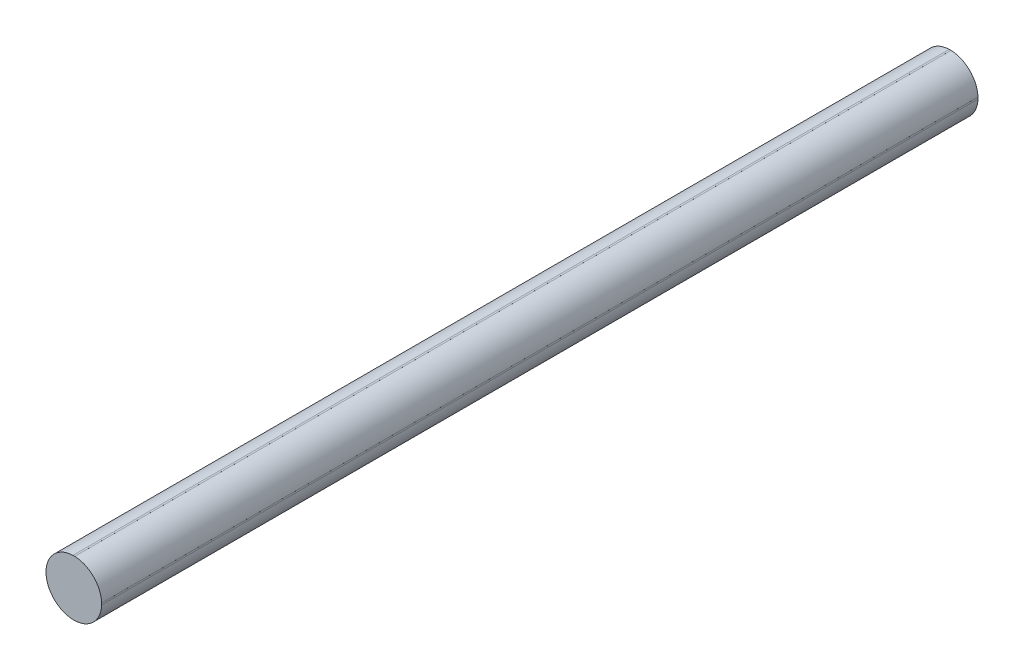
ISO-10303-21;
HEADER;
FILE_DESCRIPTION(('STEP AP214'),'2;1');
FILE_NAME('part.step','',(''),(''),'','','');
FILE_SCHEMA(('AUTOMOTIVE_DESIGN { 1 0 10303 214 1 1 1 1 }'));
ENDSEC;
DATA;
#1=APPLICATION_CONTEXT('core data for automotive mechanical design processes');
#2=APPLICATION_PROTOCOL_DEFINITION('international standard','automotive_design',2000,#1);
#3=PRODUCT_CONTEXT('',#1,'mechanical');
#4=PRODUCT('Part','Part','',(#3));
#5=PRODUCT_RELATED_PRODUCT_CATEGORY('part','',(#4));
#6=PRODUCT_DEFINITION_FORMATION('','',#4);
#7=PRODUCT_DEFINITION_CONTEXT('part definition',#1,'design');
#8=PRODUCT_DEFINITION('design','',#6,#7);
#9=PRODUCT_DEFINITION_SHAPE('','',#8);
#10=(LENGTH_UNIT() NAMED_UNIT(*) SI_UNIT(.MILLI.,.METRE.));
#11=(NAMED_UNIT(*) PLANE_ANGLE_UNIT() SI_UNIT($,.RADIAN.));
#12=(NAMED_UNIT(*) SI_UNIT($,.STERADIAN.) SOLID_ANGLE_UNIT());
#13=UNCERTAINTY_MEASURE_WITH_UNIT(LENGTH_MEASURE(1.E-05),#10,'distance_accuracy_value','');
#14=(GEOMETRIC_REPRESENTATION_CONTEXT(3) GLOBAL_UNCERTAINTY_ASSIGNED_CONTEXT((#13)) GLOBAL_UNIT_ASSIGNED_CONTEXT((#10,
#11,#12)) REPRESENTATION_CONTEXT('',''));
#15=CARTESIAN_POINT('',(0.,0.,0.));
#16=DIRECTION('',(0.,0.,1.));
#17=DIRECTION('',(1.,0.,0.));
#18=AXIS2_PLACEMENT_3D('',#15,#16,#17);
#19=CARTESIAN_POINT('',(0.,0.,1000.));
#20=DIRECTION('',(0.,0.,-1.));
#21=DIRECTION('',(-1.,0.,0.));
#22=AXIS2_PLACEMENT_3D('',#19,#20,#21);
#23=CYLINDRICAL_SURFACE('',#22,31.75);
#24=CARTESIAN_POINT('',(0.,0.,0.));
#25=DIRECTION('',(0.,0.,1.));
#26=DIRECTION('',(1.,0.,0.));
#27=AXIS2_PLACEMENT_3D('',#24,#25,#26);
#28=CIRCLE('',#27,31.75);
#29=CARTESIAN_POINT('',(-31.734248061046,-1.00000000000004,0.));
#30=VERTEX_POINT('',#29);
#31=CARTESIAN_POINT('',(-1.,-31.734248061046,0.));
#32=VERTEX_POINT('',#31);
#33=EDGE_CURVE('E265',#30,#32,#28,.T.);
#34=ORIENTED_EDGE('',*,*,#33,.T.);
#35=DIRECTION('',(0.,0.,-1.));
#36=VECTOR('',#35,1.);
#37=CARTESIAN_POINT('',(-1.,-31.734248061046,1000.));
#38=LINE('',#37,#36);
#39=CARTESIAN_POINT('',(-1.,-31.734248061046,1000.));
#40=VERTEX_POINT('',#39);
#41=EDGE_CURVE('E61',#32,#40,#38,.F.);
#42=ORIENTED_EDGE('',*,*,#41,.T.);
#43=CARTESIAN_POINT('',(0.,0.,1000.));
#44=DIRECTION('',(0.,0.,1.));
#45=DIRECTION('',(1.,0.,0.));
#46=AXIS2_PLACEMENT_3D('',#43,#44,#45);
#47=CIRCLE('',#46,31.75);
#48=CARTESIAN_POINT('',(-31.734248061046,-1.00000000000004,1000.));
#49=VERTEX_POINT('',#48);
#50=EDGE_CURVE('E159',#49,#40,#47,.T.);
#51=ORIENTED_EDGE('',*,*,#50,.F.);
#52=DIRECTION('',(0.,0.,-1.));
#53=VECTOR('',#52,1.);
#54=CARTESIAN_POINT('',(-31.734248061046,-1.00000000000004,1000.));
#55=LINE('',#54,#53);
#56=EDGE_CURVE('E206',#49,#30,#55,.T.);
#57=ORIENTED_EDGE('',*,*,#56,.T.);
#58=EDGE_LOOP('',(#34,#42,#51,#57));
#59=FACE_BOUND('',#58,.T.);
#60=ADVANCED_FACE('F37',(#59),#23,.T.);
#61=CARTESIAN_POINT('',(-1.00000000000001,31.734248061046,0.));
#62=VERTEX_POINT('',#61);
#63=CARTESIAN_POINT('',(-31.734248061046,0.99999999999997,0.));
#64=VERTEX_POINT('',#63);
#65=EDGE_CURVE('E266',#62,#64,#28,.T.);
#66=ORIENTED_EDGE('',*,*,#65,.T.);
#67=DIRECTION('',(0.,0.,-1.));
#68=VECTOR('',#67,1.);
#69=CARTESIAN_POINT('',(-31.734248061046,0.99999999999997,1000.));
#70=LINE('',#69,#68);
#71=CARTESIAN_POINT('',(-31.734248061046,0.99999999999997,1000.));
#72=VERTEX_POINT('',#71);
#73=EDGE_CURVE('E209',#64,#72,#70,.F.);
#74=ORIENTED_EDGE('',*,*,#73,.T.);
#75=CARTESIAN_POINT('',(-1.00000000000001,31.734248061046,1000.));
#76=VERTEX_POINT('',#75);
#77=EDGE_CURVE('E46',#76,#72,#47,.T.);
#78=ORIENTED_EDGE('',*,*,#77,.F.);
#79=DIRECTION('',(0.,0.,-1.));
#80=VECTOR('',#79,1.);
#81=CARTESIAN_POINT('',(-1.00000000000001,31.734248061046,1000.));
#82=LINE('',#81,#80);
#83=EDGE_CURVE('E233',#76,#62,#82,.T.);
#84=ORIENTED_EDGE('',*,*,#83,.T.);
#85=EDGE_LOOP('',(#66,#74,#78,#84));
#86=FACE_BOUND('',#85,.T.);
#87=ADVANCED_FACE('F272',(#86),#23,.T.);
#88=CARTESIAN_POINT('',(31.734248061046,1.,0.));
#89=VERTEX_POINT('',#88);
#90=CARTESIAN_POINT('',(0.999999999999993,31.734248061046,0.));
#91=VERTEX_POINT('',#90);
#92=EDGE_CURVE('E41',#89,#91,#28,.T.);
#93=ORIENTED_EDGE('',*,*,#92,.T.);
#94=DIRECTION('',(0.,0.,-1.));
#95=VECTOR('',#94,1.);
#96=CARTESIAN_POINT('',(0.999999999999993,31.734248061046,1000.));
#97=LINE('',#96,#95);
#98=CARTESIAN_POINT('',(0.999999999999993,31.734248061046,1000.));
#99=VERTEX_POINT('',#98);
#100=EDGE_CURVE('E236',#91,#99,#97,.F.);
#101=ORIENTED_EDGE('',*,*,#100,.T.);
#102=CARTESIAN_POINT('',(31.734248061046,1.,1000.));
#103=VERTEX_POINT('',#102);
#104=EDGE_CURVE('E11',#103,#99,#47,.T.);
#105=ORIENTED_EDGE('',*,*,#104,.F.);
#106=DIRECTION('',(0.,0.,-1.));
#107=VECTOR('',#106,1.);
#108=CARTESIAN_POINT('',(31.734248061046,1.,1000.));
#109=LINE('',#108,#107);
#110=EDGE_CURVE('E259',#103,#89,#109,.T.);
#111=ORIENTED_EDGE('',*,*,#110,.T.);
#112=EDGE_LOOP('',(#93,#101,#105,#111));
#113=FACE_BOUND('',#112,.T.);
#114=ADVANCED_FACE('F303',(#113),#23,.T.);
#115=CARTESIAN_POINT('',(1.,-31.734248061046,1000.));
#116=VERTEX_POINT('',#115);
#117=CARTESIAN_POINT('',(31.734248061046,-0.999999999999996,1000.));
#118=VERTEX_POINT('',#117);
#119=EDGE_CURVE('E47',#116,#118,#47,.T.);
#120=ORIENTED_EDGE('',*,*,#119,.F.);
#121=DIRECTION('',(0.,0.,-1.));
#122=VECTOR('',#121,1.);
#123=CARTESIAN_POINT('',(1.,-31.734248061046,1000.));
#124=LINE('',#123,#122);
#125=CARTESIAN_POINT('',(1.,-31.734248061046,0.));
#126=VERTEX_POINT('',#125);
#127=EDGE_CURVE('E183',#116,#126,#124,.T.);
#128=ORIENTED_EDGE('',*,*,#127,.T.);
#129=CARTESIAN_POINT('',(31.734248061046,-0.999999999999996,0.));
#130=VERTEX_POINT('',#129);
#131=EDGE_CURVE('E262',#126,#130,#28,.T.);
#132=ORIENTED_EDGE('',*,*,#131,.T.);
#133=DIRECTION('',(0.,0.,-1.));
#134=VECTOR('',#133,1.);
#135=CARTESIAN_POINT('',(31.734248061046,-0.999999999999996,1000.));
#136=LINE('',#135,#134);
#137=EDGE_CURVE('E261',#130,#118,#136,.F.);
#138=ORIENTED_EDGE('',*,*,#137,.T.);
#139=EDGE_LOOP('',(#120,#128,#132,#138));
#140=FACE_BOUND('',#139,.T.);
#141=ADVANCED_FACE('F39',(#140),#23,.T.);
#142=CARTESIAN_POINT('',(0.,0.,1000.));
#143=DIRECTION('',(0.,0.,1.));
#144=DIRECTION('',(1.,0.,0.));
#145=AXIS2_PLACEMENT_3D('',#142,#143,#144);
#146=PLANE('',#145);
#147=ORIENTED_EDGE('',*,*,#50,.T.);
#148=DIRECTION('',(0.,-1.,0.));
#149=VECTOR('',#148,1.);
#150=CARTESIAN_POINT('',(-1.,-30.75,1000.));
#151=LINE('',#150,#149);
#152=CARTESIAN_POINT('',(-1.,-31.75,1000.));
#153=VERTEX_POINT('',#152);
#154=EDGE_CURVE('E151',#40,#153,#151,.T.);
#155=ORIENTED_EDGE('',*,*,#154,.T.);
#156=DIRECTION('',(1.,0.,0.));
#157=VECTOR('',#156,1.);
#158=CARTESIAN_POINT('',(0.,-31.75,1000.));
#159=LINE('',#158,#157);
#160=CARTESIAN_POINT('',(1.,-31.75,1000.));
#161=VERTEX_POINT('',#160);
#162=EDGE_CURVE('E156',#153,#161,#159,.T.);
#163=ORIENTED_EDGE('',*,*,#162,.T.);
#164=DIRECTION('',(0.,1.,0.));
#165=VECTOR('',#164,1.);
#166=CARTESIAN_POINT('',(1.,-31.75,1000.));
#167=LINE('',#166,#165);
#168=EDGE_CURVE('E170',#161,#116,#167,.T.);
#169=ORIENTED_EDGE('',*,*,#168,.T.);
#170=ORIENTED_EDGE('',*,*,#119,.T.);
#171=DIRECTION('',(1.,0.,0.));
#172=VECTOR('',#171,1.);
#173=CARTESIAN_POINT('',(31.75,-0.999999999999996,1000.));
#174=LINE('',#173,#172);
#175=CARTESIAN_POINT('',(31.75,-0.999999999999996,1000.));
#176=VERTEX_POINT('',#175);
#177=EDGE_CURVE('E248',#118,#176,#174,.T.);
#178=ORIENTED_EDGE('',*,*,#177,.T.);
#179=DIRECTION('',(0.,1.,0.));
#180=VECTOR('',#179,1.);
#181=CARTESIAN_POINT('',(31.75,0.,1000.));
#182=LINE('',#181,#180);
#183=CARTESIAN_POINT('',(31.75,1.,1000.));
#184=VERTEX_POINT('',#183);
#185=EDGE_CURVE('E251',#176,#184,#182,.T.);
#186=ORIENTED_EDGE('',*,*,#185,.T.);
#187=DIRECTION('',(-1.,0.,0.));
#188=VECTOR('',#187,1.);
#189=CARTESIAN_POINT('',(30.75,1.,1000.));
#190=LINE('',#189,#188);
#191=EDGE_CURVE('E238',#184,#103,#190,.T.);
#192=ORIENTED_EDGE('',*,*,#191,.T.);
#193=ORIENTED_EDGE('',*,*,#104,.T.);
#194=DIRECTION('',(0.,1.,0.));
#195=VECTOR('',#194,1.);
#196=CARTESIAN_POINT('',(0.999999999999993,31.75,1000.));
#197=LINE('',#196,#195);
#198=CARTESIAN_POINT('',(0.999999999999993,31.75,1000.));
#199=VERTEX_POINT('',#198);
#200=EDGE_CURVE('E221',#99,#199,#197,.T.);
#201=ORIENTED_EDGE('',*,*,#200,.T.);
#202=DIRECTION('',(-1.,0.,0.));
#203=VECTOR('',#202,1.);
#204=CARTESIAN_POINT('',(0.,31.75,1000.));
#205=LINE('',#204,#203);
#206=CARTESIAN_POINT('',(-1.00000000000001,31.75,1000.));
#207=VERTEX_POINT('',#206);
#208=EDGE_CURVE('E224',#199,#207,#205,.T.);
#209=ORIENTED_EDGE('',*,*,#208,.T.);
#210=DIRECTION('',(0.,-1.,0.));
#211=VECTOR('',#210,1.);
#212=CARTESIAN_POINT('',(-1.00000000000001,30.75,1000.));
#213=LINE('',#212,#211);
#214=EDGE_CURVE('E211',#207,#76,#213,.T.);
#215=ORIENTED_EDGE('',*,*,#214,.T.);
#216=ORIENTED_EDGE('',*,*,#77,.T.);
#217=DIRECTION('',(-1.,0.,0.));
#218=VECTOR('',#217,1.);
#219=CARTESIAN_POINT('',(-30.75,0.999999999999973,1000.));
#220=LINE('',#219,#218);
#221=CARTESIAN_POINT('',(-31.75,0.99999999999997,1000.));
#222=VERTEX_POINT('',#221);
#223=EDGE_CURVE('E186',#72,#222,#220,.T.);
#224=ORIENTED_EDGE('',*,*,#223,.T.);
#225=DIRECTION('',(0.,-1.,0.));
#226=VECTOR('',#225,1.);
#227=CARTESIAN_POINT('',(-31.75,0.,1000.));
#228=LINE('',#227,#226);
#229=CARTESIAN_POINT('',(-31.75,-1.00000000000004,1000.));
#230=VERTEX_POINT('',#229);
#231=EDGE_CURVE('E196',#222,#230,#228,.T.);
#232=ORIENTED_EDGE('',*,*,#231,.T.);
#233=DIRECTION('',(1.,0.,0.));
#234=VECTOR('',#233,1.);
#235=CARTESIAN_POINT('',(-31.75,-1.00000000000004,1000.));
#236=LINE('',#235,#234);
#237=EDGE_CURVE('E198',#230,#49,#236,.T.);
#238=ORIENTED_EDGE('',*,*,#237,.T.);
#239=EDGE_LOOP('',(#147,#155,#163,#169,#170,#178,#186,#192,#193,#201,#209,#215,#216,#224,#232,#238));
#240=FACE_BOUND('',#239,.T.);
#241=ADVANCED_FACE('F153',(#240),#146,.T.);
#242=CARTESIAN_POINT('',(0.,0.,0.));
#243=DIRECTION('',(0.,0.,1.));
#244=DIRECTION('',(1.,0.,0.));
#245=AXIS2_PLACEMENT_3D('',#242,#243,#244);
#246=PLANE('',#245);
#247=DIRECTION('',(0.,-1.,0.));
#248=VECTOR('',#247,1.);
#249=CARTESIAN_POINT('',(1.,-31.75,0.));
#250=LINE('',#249,#248);
#251=CARTESIAN_POINT('',(1.,-31.75,0.));
#252=VERTEX_POINT('',#251);
#253=EDGE_CURVE('E179',#126,#252,#250,.T.);
#254=ORIENTED_EDGE('',*,*,#253,.T.);
#255=DIRECTION('',(-1.,0.,0.));
#256=VECTOR('',#255,1.);
#257=CARTESIAN_POINT('',(0.,-31.75,0.));
#258=LINE('',#257,#256);
#259=CARTESIAN_POINT('',(-1.,-31.75,0.));
#260=VERTEX_POINT('',#259);
#261=EDGE_CURVE('E181',#252,#260,#258,.T.);
#262=ORIENTED_EDGE('',*,*,#261,.T.);
#263=DIRECTION('',(0.,1.,0.));
#264=VECTOR('',#263,1.);
#265=CARTESIAN_POINT('',(-1.,-30.75,0.));
#266=LINE('',#265,#264);
#267=EDGE_CURVE('E167',#260,#32,#266,.T.);
#268=ORIENTED_EDGE('',*,*,#267,.T.);
#269=ORIENTED_EDGE('',*,*,#33,.F.);
#270=DIRECTION('',(-1.,0.,0.));
#271=VECTOR('',#270,1.);
#272=CARTESIAN_POINT('',(-31.75,-1.00000000000004,0.));
#273=LINE('',#272,#271);
#274=CARTESIAN_POINT('',(-31.75,-1.00000000000004,0.));
#275=VERTEX_POINT('',#274);
#276=EDGE_CURVE('E187',#30,#275,#273,.T.);
#277=ORIENTED_EDGE('',*,*,#276,.T.);
#278=DIRECTION('',(0.,1.,0.));
#279=VECTOR('',#278,1.);
#280=CARTESIAN_POINT('',(-31.75,0.,0.));
#281=LINE('',#280,#279);
#282=CARTESIAN_POINT('',(-31.75,0.99999999999997,0.));
#283=VERTEX_POINT('',#282);
#284=EDGE_CURVE('E194',#275,#283,#281,.T.);
#285=ORIENTED_EDGE('',*,*,#284,.T.);
#286=DIRECTION('',(1.,0.,0.));
#287=VECTOR('',#286,1.);
#288=CARTESIAN_POINT('',(-30.75,0.999999999999973,0.));
#289=LINE('',#288,#287);
#290=EDGE_CURVE('E190',#283,#64,#289,.T.);
#291=ORIENTED_EDGE('',*,*,#290,.T.);
#292=ORIENTED_EDGE('',*,*,#65,.F.);
#293=DIRECTION('',(0.,1.,0.));
#294=VECTOR('',#293,1.);
#295=CARTESIAN_POINT('',(-1.00000000000001,30.75,0.));
#296=LINE('',#295,#294);
#297=CARTESIAN_POINT('',(-1.00000000000001,31.75,0.));
#298=VERTEX_POINT('',#297);
#299=EDGE_CURVE('E218',#62,#298,#296,.T.);
#300=ORIENTED_EDGE('',*,*,#299,.T.);
#301=DIRECTION('',(1.,0.,0.));
#302=VECTOR('',#301,1.);
#303=CARTESIAN_POINT('',(0.,31.75,0.));
#304=LINE('',#303,#302);
#305=CARTESIAN_POINT('',(0.999999999999993,31.75,0.));
#306=VERTEX_POINT('',#305);
#307=EDGE_CURVE('E215',#298,#306,#304,.T.);
#308=ORIENTED_EDGE('',*,*,#307,.T.);
#309=DIRECTION('',(0.,-1.,0.));
#310=VECTOR('',#309,1.);
#311=CARTESIAN_POINT('',(0.999999999999993,31.75,0.));
#312=LINE('',#311,#310);
#313=EDGE_CURVE('E212',#306,#91,#312,.T.);
#314=ORIENTED_EDGE('',*,*,#313,.T.);
#315=ORIENTED_EDGE('',*,*,#92,.F.);
#316=DIRECTION('',(1.,0.,0.));
#317=VECTOR('',#316,1.);
#318=CARTESIAN_POINT('',(30.75,1.,0.));
#319=LINE('',#318,#317);
#320=CARTESIAN_POINT('',(31.75,1.,0.));
#321=VERTEX_POINT('',#320);
#322=EDGE_CURVE('E245',#89,#321,#319,.T.);
#323=ORIENTED_EDGE('',*,*,#322,.T.);
#324=DIRECTION('',(0.,-1.,0.));
#325=VECTOR('',#324,1.);
#326=CARTESIAN_POINT('',(31.75,0.,0.));
#327=LINE('',#326,#325);
#328=CARTESIAN_POINT('',(31.75,-0.999999999999996,0.));
#329=VERTEX_POINT('',#328);
#330=EDGE_CURVE('E242',#321,#329,#327,.T.);
#331=ORIENTED_EDGE('',*,*,#330,.T.);
#332=DIRECTION('',(-1.,0.,0.));
#333=VECTOR('',#332,1.);
#334=CARTESIAN_POINT('',(31.75,-0.999999999999996,0.));
#335=LINE('',#334,#333);
#336=EDGE_CURVE('E239',#329,#130,#335,.T.);
#337=ORIENTED_EDGE('',*,*,#336,.T.);
#338=ORIENTED_EDGE('',*,*,#131,.F.);
#339=EDGE_LOOP('',(#254,#262,#268,#269,#277,#285,#291,#292,#300,#308,#314,#315,#323,#331,#337,#338));
#340=FACE_BOUND('',#339,.T.);
#341=ADVANCED_FACE('F283',(#340),#246,.F.);
#342=CARTESIAN_POINT('',(31.75,0.,-2.23606797749998));
#343=DIRECTION('',(1.,0.,0.));
#344=DIRECTION('',(0.,0.,-1.));
#345=AXIS2_PLACEMENT_3D('',#342,#343,#344);
#346=PLANE('',#345);
#347=DIRECTION('',(0.,0.,1.));
#348=VECTOR('',#347,1.);
#349=CARTESIAN_POINT('',(31.75,-0.999999999999996,-2.23606797749998));
#350=LINE('',#349,#348);
#351=EDGE_CURVE('E243',#329,#176,#350,.T.);
#352=ORIENTED_EDGE('',*,*,#351,.F.);
#353=ORIENTED_EDGE('',*,*,#330,.F.);
#354=DIRECTION('',(0.,0.,1.));
#355=VECTOR('',#354,1.);
#356=CARTESIAN_POINT('',(31.75,1.,-2.23606797749998));
#357=LINE('',#356,#355);
#358=EDGE_CURVE('E253',#321,#184,#357,.T.);
#359=ORIENTED_EDGE('',*,*,#358,.T.);
#360=ORIENTED_EDGE('',*,*,#185,.F.);
#361=EDGE_LOOP('',(#352,#353,#359,#360));
#362=FACE_BOUND('',#361,.T.);
#363=ADVANCED_FACE('F312',(#362),#346,.T.);
#364=CARTESIAN_POINT('',(31.75,-0.999999999999996,-2.23606797749998));
#365=DIRECTION('',(0.,-1.,0.));
#366=DIRECTION('',(1.,0.,0.));
#367=AXIS2_PLACEMENT_3D('',#364,#365,#366);
#368=PLANE('',#367);
#369=ORIENTED_EDGE('',*,*,#137,.F.);
#370=ORIENTED_EDGE('',*,*,#336,.F.);
#371=ORIENTED_EDGE('',*,*,#351,.T.);
#372=ORIENTED_EDGE('',*,*,#177,.F.);
#373=EDGE_LOOP('',(#369,#370,#371,#372));
#374=FACE_BOUND('',#373,.T.);
#375=ADVANCED_FACE('F314',(#374),#368,.T.);
#376=CARTESIAN_POINT('',(30.75,1.,-2.23606797749998));
#377=DIRECTION('',(0.,1.,0.));
#378=DIRECTION('',(-1.,0.,0.));
#379=AXIS2_PLACEMENT_3D('',#376,#377,#378);
#380=PLANE('',#379);
#381=ORIENTED_EDGE('',*,*,#110,.F.);
#382=ORIENTED_EDGE('',*,*,#191,.F.);
#383=ORIENTED_EDGE('',*,*,#358,.F.);
#384=ORIENTED_EDGE('',*,*,#322,.F.);
#385=EDGE_LOOP('',(#381,#382,#383,#384));
#386=FACE_BOUND('',#385,.T.);
#387=ADVANCED_FACE('F306',(#386),#380,.T.);
#388=CARTESIAN_POINT('',(0.,31.75,-2.23606797749998));
#389=DIRECTION('',(0.,1.,0.));
#390=DIRECTION('',(0.,0.,1.));
#391=AXIS2_PLACEMENT_3D('',#388,#389,#390);
#392=PLANE('',#391);
#393=ORIENTED_EDGE('',*,*,#307,.F.);
#394=DIRECTION('',(0.,0.,1.));
#395=VECTOR('',#394,1.);
#396=CARTESIAN_POINT('',(-1.00000000000001,31.75,-2.23606797749998));
#397=LINE('',#396,#395);
#398=EDGE_CURVE('E226',#298,#207,#397,.T.);
#399=ORIENTED_EDGE('',*,*,#398,.T.);
#400=ORIENTED_EDGE('',*,*,#208,.F.);
#401=DIRECTION('',(0.,0.,1.));
#402=VECTOR('',#401,1.);
#403=CARTESIAN_POINT('',(0.999999999999993,31.75,-2.23606797749998));
#404=LINE('',#403,#402);
#405=EDGE_CURVE('E216',#306,#199,#404,.T.);
#406=ORIENTED_EDGE('',*,*,#405,.F.);
#407=EDGE_LOOP('',(#393,#399,#400,#406));
#408=FACE_BOUND('',#407,.T.);
#409=ADVANCED_FACE('F300',(#408),#392,.T.);
#410=CARTESIAN_POINT('',(0.999999999999993,31.75,-2.23606797749998));
#411=DIRECTION('',(1.,0.,0.));
#412=DIRECTION('',(0.,1.,0.));
#413=AXIS2_PLACEMENT_3D('',#410,#411,#412);
#414=PLANE('',#413);
#415=ORIENTED_EDGE('',*,*,#100,.F.);
#416=ORIENTED_EDGE('',*,*,#313,.F.);
#417=ORIENTED_EDGE('',*,*,#405,.T.);
#418=ORIENTED_EDGE('',*,*,#200,.F.);
#419=EDGE_LOOP('',(#415,#416,#417,#418));
#420=FACE_BOUND('',#419,.T.);
#421=ADVANCED_FACE('F298',(#420),#414,.T.);
#422=CARTESIAN_POINT('',(-1.00000000000001,30.75,-2.23606797749998));
#423=DIRECTION('',(-1.,0.,0.));
#424=DIRECTION('',(0.,-1.,0.));
#425=AXIS2_PLACEMENT_3D('',#422,#423,#424);
#426=PLANE('',#425);
#427=ORIENTED_EDGE('',*,*,#83,.F.);
#428=ORIENTED_EDGE('',*,*,#214,.F.);
#429=ORIENTED_EDGE('',*,*,#398,.F.);
#430=ORIENTED_EDGE('',*,*,#299,.F.);
#431=EDGE_LOOP('',(#427,#428,#429,#430));
#432=FACE_BOUND('',#431,.T.);
#433=ADVANCED_FACE('F292',(#432),#426,.T.);
#434=CARTESIAN_POINT('',(-30.75,0.999999999999973,-2.23606797749998));
#435=DIRECTION('',(0.,1.,0.));
#436=DIRECTION('',(-1.,0.,0.));
#437=AXIS2_PLACEMENT_3D('',#434,#435,#436);
#438=PLANE('',#437);
#439=ORIENTED_EDGE('',*,*,#73,.F.);
#440=ORIENTED_EDGE('',*,*,#290,.F.);
#441=DIRECTION('',(0.,0.,1.));
#442=VECTOR('',#441,1.);
#443=CARTESIAN_POINT('',(-31.75,0.99999999999997,-2.23606797749998));
#444=LINE('',#443,#442);
#445=EDGE_CURVE('E200',#283,#222,#444,.T.);
#446=ORIENTED_EDGE('',*,*,#445,.T.);
#447=ORIENTED_EDGE('',*,*,#223,.F.);
#448=EDGE_LOOP('',(#439,#440,#446,#447));
#449=FACE_BOUND('',#448,.T.);
#450=ADVANCED_FACE('F280',(#449),#438,.T.);
#451=CARTESIAN_POINT('',(-31.75,-1.00000000000004,-2.23606797749998));
#452=DIRECTION('',(0.,-1.,0.));
#453=DIRECTION('',(1.,0.,0.));
#454=AXIS2_PLACEMENT_3D('',#451,#452,#453);
#455=PLANE('',#454);
#456=ORIENTED_EDGE('',*,*,#56,.F.);
#457=ORIENTED_EDGE('',*,*,#237,.F.);
#458=DIRECTION('',(0.,0.,1.));
#459=VECTOR('',#458,1.);
#460=CARTESIAN_POINT('',(-31.75,-1.00000000000004,-2.23606797749998));
#461=LINE('',#460,#459);
#462=EDGE_CURVE('E191',#275,#230,#461,.T.);
#463=ORIENTED_EDGE('',*,*,#462,.F.);
#464=ORIENTED_EDGE('',*,*,#276,.F.);
#465=EDGE_LOOP('',(#456,#457,#463,#464));
#466=FACE_BOUND('',#465,.T.);
#467=ADVANCED_FACE('F321',(#466),#455,.T.);
#468=CARTESIAN_POINT('',(-31.75,0.,-2.23606797749998));
#469=DIRECTION('',(-1.,0.,0.));
#470=DIRECTION('',(0.,0.,1.));
#471=AXIS2_PLACEMENT_3D('',#468,#469,#470);
#472=PLANE('',#471);
#473=ORIENTED_EDGE('',*,*,#284,.F.);
#474=ORIENTED_EDGE('',*,*,#462,.T.);
#475=ORIENTED_EDGE('',*,*,#231,.F.);
#476=ORIENTED_EDGE('',*,*,#445,.F.);
#477=EDGE_LOOP('',(#473,#474,#475,#476));
#478=FACE_BOUND('',#477,.T.);
#479=ADVANCED_FACE('F287',(#478),#472,.T.);
#480=CARTESIAN_POINT('',(-1.,-30.75,-2.23606797749998));
#481=DIRECTION('',(-1.,0.,0.));
#482=DIRECTION('',(0.,0.,1.));
#483=AXIS2_PLACEMENT_3D('',#480,#481,#482);
#484=PLANE('',#483);
#485=ORIENTED_EDGE('',*,*,#41,.F.);
#486=ORIENTED_EDGE('',*,*,#267,.F.);
#487=DIRECTION('',(0.,0.,1.));
#488=VECTOR('',#487,1.);
#489=CARTESIAN_POINT('',(-1.,-31.75,-2.23606797749998));
#490=LINE('',#489,#488);
#491=EDGE_CURVE('E164',#260,#153,#490,.T.);
#492=ORIENTED_EDGE('',*,*,#491,.T.);
#493=ORIENTED_EDGE('',*,*,#154,.F.);
#494=EDGE_LOOP('',(#485,#486,#492,#493));
#495=FACE_BOUND('',#494,.T.);
#496=ADVANCED_FACE('F165',(#495),#484,.T.);
#497=CARTESIAN_POINT('',(1.,-31.75,-2.23606797749998));
#498=DIRECTION('',(1.,0.,0.));
#499=DIRECTION('',(0.,0.,-1.));
#500=AXIS2_PLACEMENT_3D('',#497,#498,#499);
#501=PLANE('',#500);
#502=ORIENTED_EDGE('',*,*,#127,.F.);
#503=ORIENTED_EDGE('',*,*,#168,.F.);
#504=DIRECTION('',(0.,0.,1.));
#505=VECTOR('',#504,1.);
#506=CARTESIAN_POINT('',(1.,-31.75,-2.23606797749998));
#507=LINE('',#506,#505);
#508=EDGE_CURVE('E169',#252,#161,#507,.T.);
#509=ORIENTED_EDGE('',*,*,#508,.F.);
#510=ORIENTED_EDGE('',*,*,#253,.F.);
#511=EDGE_LOOP('',(#502,#503,#509,#510));
#512=FACE_BOUND('',#511,.T.);
#513=ADVANCED_FACE('F317',(#512),#501,.T.);
#514=CARTESIAN_POINT('',(0.,-31.75,-2.23606797749998));
#515=DIRECTION('',(0.,-1.,0.));
#516=DIRECTION('',(0.,0.,-1.));
#517=AXIS2_PLACEMENT_3D('',#514,#515,#516);
#518=PLANE('',#517);
#519=ORIENTED_EDGE('',*,*,#261,.F.);
#520=ORIENTED_EDGE('',*,*,#508,.T.);
#521=ORIENTED_EDGE('',*,*,#162,.F.);
#522=ORIENTED_EDGE('',*,*,#491,.F.);
#523=EDGE_LOOP('',(#519,#520,#521,#522));
#524=FACE_BOUND('',#523,.T.);
#525=ADVANCED_FACE('F172',(#524),#518,.T.);
#526=CLOSED_SHELL('',(#60,#87,#114,#141,#241,#341,#363,#375,#387,#409,#421,#433,#450,#467,#479,
#496,#513,#525));
#527=MANIFOLD_SOLID_BREP('B2',#526);
#528=ADVANCED_BREP_SHAPE_REPRESENTATION('',(#18,#527),#14);
#529=SHAPE_DEFINITION_REPRESENTATION(#9,#528);
ENDSEC;
END-ISO-10303-21;
